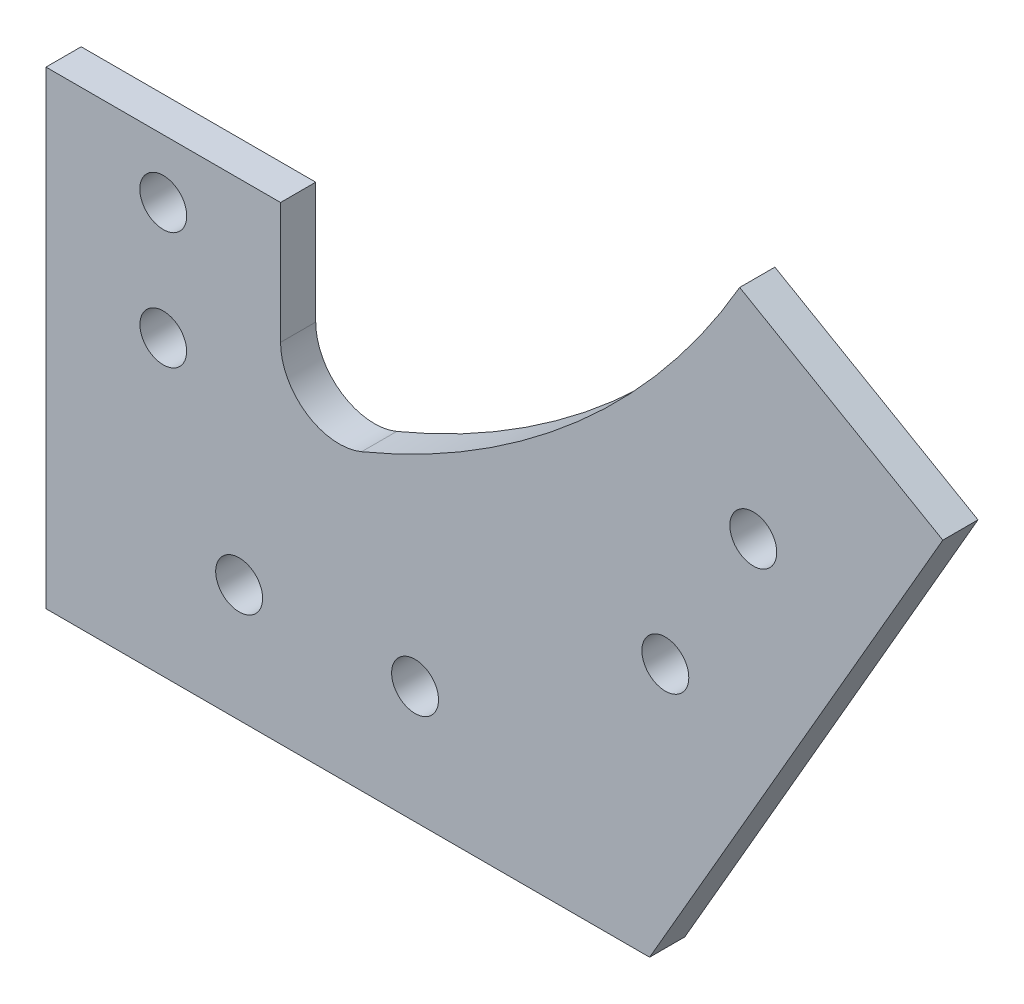
ISO-10303-21;
HEADER;
FILE_DESCRIPTION(('STEP AP214'),'2;1');
FILE_NAME('part.step','',(''),(''),'','','');
FILE_SCHEMA(('AUTOMOTIVE_DESIGN { 1 0 10303 214 1 1 1 1 }'));
ENDSEC;
DATA;
#1=APPLICATION_CONTEXT('core data for automotive mechanical design processes');
#2=APPLICATION_PROTOCOL_DEFINITION('international standard','automotive_design',2000,#1);
#3=PRODUCT_CONTEXT('',#1,'mechanical');
#4=PRODUCT('Part','Part','',(#3));
#5=PRODUCT_RELATED_PRODUCT_CATEGORY('part','',(#4));
#6=PRODUCT_DEFINITION_FORMATION('','',#4);
#7=PRODUCT_DEFINITION_CONTEXT('part definition',#1,'design');
#8=PRODUCT_DEFINITION('design','',#6,#7);
#9=PRODUCT_DEFINITION_SHAPE('','',#8);
#10=(LENGTH_UNIT() NAMED_UNIT(*) SI_UNIT(.MILLI.,.METRE.));
#11=(NAMED_UNIT(*) PLANE_ANGLE_UNIT() SI_UNIT($,.RADIAN.));
#12=(NAMED_UNIT(*) SI_UNIT($,.STERADIAN.) SOLID_ANGLE_UNIT());
#13=UNCERTAINTY_MEASURE_WITH_UNIT(LENGTH_MEASURE(1.E-05),#10,'distance_accuracy_value','');
#14=(GEOMETRIC_REPRESENTATION_CONTEXT(3) GLOBAL_UNCERTAINTY_ASSIGNED_CONTEXT((#13)) GLOBAL_UNIT_ASSIGNED_CONTEXT((#10,
#11,#12)) REPRESENTATION_CONTEXT('',''));
#15=CARTESIAN_POINT('',(0.,0.,0.));
#16=DIRECTION('',(0.,0.,1.));
#17=DIRECTION('',(1.,0.,0.));
#18=AXIS2_PLACEMENT_3D('',#15,#16,#17);
#19=CARTESIAN_POINT('',(-11.6514577470838,-45.9841600862571,3.));
#20=DIRECTION('',(0.,0.,1.));
#21=DIRECTION('',(1.,0.,0.));
#22=AXIS2_PLACEMENT_3D('',#19,#20,#21);
#23=PLANE('',#22);
#24=CARTESIAN_POINT('',(16.158288215072,-53.3345484545726,3.));
#25=DIRECTION('',(0.,0.,1.));
#26=DIRECTION('',(1.,0.,0.));
#27=AXIS2_PLACEMENT_3D('',#24,#25,#26);
#28=CIRCLE('',#27,2.);
#29=CARTESIAN_POINT('',(18.158288215072,-53.3345484545726,3.));
#30=VERTEX_POINT('',#29);
#31=EDGE_CURVE('E243',#30,#30,#28,.T.);
#32=ORIENTED_EDGE('',*,*,#31,.F.);
#33=EDGE_LOOP('',(#32));
#34=FACE_BOUND('',#33,.T.);
#35=CARTESIAN_POINT('',(-20.1814577470836,-65.6550565302616,3.));
#36=DIRECTION('',(0.,0.,1.));
#37=DIRECTION('',(1.,0.,0.));
#38=AXIS2_PLACEMENT_3D('',#35,#36,#37);
#39=CIRCLE('',#38,2.);
#40=CARTESIAN_POINT('',(-18.1814577470836,-65.6550565302616,3.));
#41=VERTEX_POINT('',#40);
#42=EDGE_CURVE('E227',#41,#41,#39,.T.);
#43=ORIENTED_EDGE('',*,*,#42,.F.);
#44=EDGE_LOOP('',(#43));
#45=FACE_BOUND('',#44,.T.);
#46=CARTESIAN_POINT('',(-26.6514577470838,-40.655056530261,3.));
#47=DIRECTION('',(0.,0.,1.));
#48=DIRECTION('',(1.,0.,0.));
#49=AXIS2_PLACEMENT_3D('',#46,#47,#48);
#50=CIRCLE('',#49,2.00000000000002);
#51=CARTESIAN_POINT('',(-24.6514577470838,-40.655056530261,3.));
#52=VERTEX_POINT('',#51);
#53=EDGE_CURVE('E152',#52,#52,#50,.T.);
#54=ORIENTED_EDGE('',*,*,#53,.F.);
#55=EDGE_LOOP('',(#54));
#56=FACE_BOUND('',#55,.T.);
#57=CARTESIAN_POINT('',(-11.6514577470838,-45.9841600862571,3.));
#58=DIRECTION('',(0.,0.,-1.));
#59=DIRECTION('',(1.,0.,0.));
#60=AXIS2_PLACEMENT_3D('',#57,#58,#59);
#61=CIRCLE('',#60,5.00000000000006);
#62=CARTESIAN_POINT('',(-9.74163391064401,-50.6050445160786,3.));
#63=VERTEX_POINT('',#62);
#64=CARTESIAN_POINT('',(-16.6514577470838,-45.9841600862571,3.));
#65=VERTEX_POINT('',#64);
#66=EDGE_CURVE('E170',#63,#65,#61,.T.);
#67=ORIENTED_EDGE('',*,*,#66,.T.);
#68=DIRECTION('',(0.,1.,0.));
#69=VECTOR('',#68,1.);
#70=CARTESIAN_POINT('',(-16.6514577470838,-45.9841600862571,3.));
#71=LINE('',#70,#69);
#72=CARTESIAN_POINT('',(-16.6514577470838,-35.6550565302611,3.));
#73=VERTEX_POINT('',#72);
#74=EDGE_CURVE('E106',#65,#73,#71,.T.);
#75=ORIENTED_EDGE('',*,*,#74,.T.);
#76=DIRECTION('',(-1.,0.,0.));
#77=VECTOR('',#76,1.);
#78=CARTESIAN_POINT('',(-16.6514577470838,-35.6550565302611,3.));
#79=LINE('',#78,#77);
#80=CARTESIAN_POINT('',(-36.6514577470841,-35.6550565302611,3.));
#81=VERTEX_POINT('',#80);
#82=EDGE_CURVE('E191',#73,#81,#79,.T.);
#83=ORIENTED_EDGE('',*,*,#82,.T.);
#84=DIRECTION('',(0.,-1.,0.));
#85=VECTOR('',#84,1.);
#86=CARTESIAN_POINT('',(-36.6514577470841,-35.6550565302611,3.));
#87=LINE('',#86,#85);
#88=CARTESIAN_POINT('',(-36.6514577470841,-75.6550565302616,3.));
#89=VERTEX_POINT('',#88);
#90=EDGE_CURVE('E205',#81,#89,#87,.T.);
#91=ORIENTED_EDGE('',*,*,#90,.T.);
#92=DIRECTION('',(1.,0.,0.));
#93=VECTOR('',#92,1.);
#94=CARTESIAN_POINT('',(-36.6514577470841,-75.6550565302616,3.));
#95=LINE('',#94,#93);
#96=CARTESIAN_POINT('',(14.8185422529163,-75.6550565302616,3.));
#97=VERTEX_POINT('',#96);
#98=EDGE_CURVE('E125',#89,#97,#95,.T.);
#99=ORIENTED_EDGE('',*,*,#98,.T.);
#100=DIRECTION('',(0.499999999999998,0.86602540378444,0.));
#101=VECTOR('',#100,1.);
#102=CARTESIAN_POINT('',(14.8185422529163,-75.6550565302616,3.));
#103=LINE('',#102,#101);
#104=CARTESIAN_POINT('',(39.8185422529163,-32.3537863410396,3.));
#105=VERTEX_POINT('',#104);
#106=EDGE_CURVE('E119',#97,#105,#103,.T.);
#107=ORIENTED_EDGE('',*,*,#106,.T.);
#108=DIRECTION('',(-0.866025403784437,0.500000000000002,0.));
#109=VECTOR('',#108,1.);
#110=CARTESIAN_POINT('',(39.8185422529163,-32.3537863410396,3.));
#111=LINE('',#110,#109);
#112=CARTESIAN_POINT('',(22.4980341772276,-22.3537863410396,3.));
#113=VERTEX_POINT('',#112);
#114=EDGE_CURVE('E123',#105,#113,#111,.T.);
#115=ORIENTED_EDGE('',*,*,#114,.T.);
#116=CARTESIAN_POINT('',(-35.1814577470836,10.9474838481824,3.));
#117=DIRECTION('',(0.,0.,-1.));
#118=DIRECTION('',(1.,0.,0.));
#119=AXIS2_PLACEMENT_3D('',#116,#117,#118);
#120=CIRCLE('',#119,66.6025403784439);
#121=EDGE_CURVE('E63',#113,#63,#120,.T.);
#122=ORIENTED_EDGE('',*,*,#121,.T.);
#123=EDGE_LOOP('',(#67,#75,#83,#91,#99,#107,#115,#122));
#124=FACE_BOUND('',#123,.T.);
#125=CARTESIAN_POINT('',(-26.6514577470838,-50.655056530261,3.));
#126=DIRECTION('',(0.,0.,1.));
#127=DIRECTION('',(1.,0.,0.));
#128=AXIS2_PLACEMENT_3D('',#125,#126,#127);
#129=CIRCLE('',#128,1.99000000000001);
#130=CARTESIAN_POINT('',(-24.6614577470838,-50.655056530261,3.));
#131=VERTEX_POINT('',#130);
#132=EDGE_CURVE('E219',#131,#131,#129,.T.);
#133=ORIENTED_EDGE('',*,*,#132,.F.);
#134=EDGE_LOOP('',(#133));
#135=FACE_BOUND('',#134,.T.);
#136=CARTESIAN_POINT('',(-5.18145774708362,-65.6550565302616,3.));
#137=DIRECTION('',(0.,0.,1.));
#138=DIRECTION('',(1.,0.,0.));
#139=AXIS2_PLACEMENT_3D('',#136,#137,#138);
#140=CIRCLE('',#139,1.99999999999997);
#141=CARTESIAN_POINT('',(-3.18145774708365,-65.6550565302616,3.));
#142=VERTEX_POINT('',#141);
#143=EDGE_CURVE('E235',#142,#142,#140,.T.);
#144=ORIENTED_EDGE('',*,*,#143,.F.);
#145=EDGE_LOOP('',(#144));
#146=FACE_BOUND('',#145,.T.);
#147=CARTESIAN_POINT('',(23.658288215072,-40.3441673978061,3.));
#148=DIRECTION('',(0.,0.,1.));
#149=DIRECTION('',(1.,0.,0.));
#150=AXIS2_PLACEMENT_3D('',#147,#148,#149);
#151=CIRCLE('',#150,1.99999999999994);
#152=CARTESIAN_POINT('',(25.6582882150719,-40.3441673978061,3.));
#153=VERTEX_POINT('',#152);
#154=EDGE_CURVE('E251',#153,#153,#151,.T.);
#155=ORIENTED_EDGE('',*,*,#154,.F.);
#156=EDGE_LOOP('',(#155));
#157=FACE_BOUND('',#156,.T.);
#158=ADVANCED_FACE('F45',(#34,#45,#56,#124,#135,#146,#157),#23,.T.);
#159=CARTESIAN_POINT('',(-11.6514577470838,-45.9841600862571,0.));
#160=DIRECTION('',(0.,0.,1.));
#161=DIRECTION('',(1.,0.,0.));
#162=AXIS2_PLACEMENT_3D('',#159,#160,#161);
#163=PLANE('',#162);
#164=CARTESIAN_POINT('',(-11.6514577470838,-45.9841600862571,0.));
#165=DIRECTION('',(0.,0.,-1.));
#166=DIRECTION('',(1.,0.,0.));
#167=AXIS2_PLACEMENT_3D('',#164,#165,#166);
#168=CIRCLE('',#167,5.00000000000006);
#169=CARTESIAN_POINT('',(-9.74163391064401,-50.6050445160786,0.));
#170=VERTEX_POINT('',#169);
#171=CARTESIAN_POINT('',(-16.6514577470838,-45.9841600862571,0.));
#172=VERTEX_POINT('',#171);
#173=EDGE_CURVE('E147',#170,#172,#168,.T.);
#174=ORIENTED_EDGE('',*,*,#173,.F.);
#175=CARTESIAN_POINT('',(-35.1814577470836,10.9474838481824,0.));
#176=DIRECTION('',(0.,0.,-1.));
#177=DIRECTION('',(1.,0.,0.));
#178=AXIS2_PLACEMENT_3D('',#175,#176,#177);
#179=CIRCLE('',#178,66.6025403784439);
#180=CARTESIAN_POINT('',(22.4980341772276,-22.3537863410396,0.));
#181=VERTEX_POINT('',#180);
#182=EDGE_CURVE('E98',#181,#170,#179,.T.);
#183=ORIENTED_EDGE('',*,*,#182,.F.);
#184=DIRECTION('',(-0.866025403784437,0.500000000000002,0.));
#185=VECTOR('',#184,1.);
#186=CARTESIAN_POINT('',(39.8185422529163,-32.3537863410396,0.));
#187=LINE('',#186,#185);
#188=CARTESIAN_POINT('',(39.8185422529163,-32.3537863410396,0.));
#189=VERTEX_POINT('',#188);
#190=EDGE_CURVE('E92',#189,#181,#187,.T.);
#191=ORIENTED_EDGE('',*,*,#190,.F.);
#192=DIRECTION('',(0.499999999999998,0.86602540378444,0.));
#193=VECTOR('',#192,1.);
#194=CARTESIAN_POINT('',(14.8185422529163,-75.6550565302616,0.));
#195=LINE('',#194,#193);
#196=CARTESIAN_POINT('',(14.8185422529163,-75.6550565302616,0.));
#197=VERTEX_POINT('',#196);
#198=EDGE_CURVE('E134',#197,#189,#195,.T.);
#199=ORIENTED_EDGE('',*,*,#198,.F.);
#200=DIRECTION('',(1.,0.,0.));
#201=VECTOR('',#200,1.);
#202=CARTESIAN_POINT('',(-36.6514577470841,-75.6550565302616,0.));
#203=LINE('',#202,#201);
#204=CARTESIAN_POINT('',(-36.6514577470841,-75.6550565302616,0.));
#205=VERTEX_POINT('',#204);
#206=EDGE_CURVE('E161',#205,#197,#203,.T.);
#207=ORIENTED_EDGE('',*,*,#206,.F.);
#208=DIRECTION('',(0.,-1.,0.));
#209=VECTOR('',#208,1.);
#210=CARTESIAN_POINT('',(-36.6514577470841,-35.6550565302611,0.));
#211=LINE('',#210,#209);
#212=CARTESIAN_POINT('',(-36.6514577470841,-35.6550565302611,0.));
#213=VERTEX_POINT('',#212);
#214=EDGE_CURVE('E158',#213,#205,#211,.T.);
#215=ORIENTED_EDGE('',*,*,#214,.F.);
#216=DIRECTION('',(-1.,0.,0.));
#217=VECTOR('',#216,1.);
#218=CARTESIAN_POINT('',(-16.6514577470838,-35.6550565302611,0.));
#219=LINE('',#218,#217);
#220=CARTESIAN_POINT('',(-16.6514577470838,-35.6550565302611,0.));
#221=VERTEX_POINT('',#220);
#222=EDGE_CURVE('E155',#221,#213,#219,.T.);
#223=ORIENTED_EDGE('',*,*,#222,.F.);
#224=DIRECTION('',(0.,1.,0.));
#225=VECTOR('',#224,1.);
#226=CARTESIAN_POINT('',(-16.6514577470838,-45.9841600862571,0.));
#227=LINE('',#226,#225);
#228=EDGE_CURVE('E151',#172,#221,#227,.T.);
#229=ORIENTED_EDGE('',*,*,#228,.F.);
#230=EDGE_LOOP('',(#174,#183,#191,#199,#207,#215,#223,#229));
#231=FACE_BOUND('',#230,.T.);
#232=CARTESIAN_POINT('',(-26.6514577470838,-40.655056530261,0.));
#233=DIRECTION('',(0.,0.,1.));
#234=DIRECTION('',(1.,0.,0.));
#235=AXIS2_PLACEMENT_3D('',#232,#233,#234);
#236=CIRCLE('',#235,2.00000000000002);
#237=CARTESIAN_POINT('',(-24.6514577470838,-40.655056530261,0.));
#238=VERTEX_POINT('',#237);
#239=EDGE_CURVE('E215',#238,#238,#236,.T.);
#240=ORIENTED_EDGE('',*,*,#239,.T.);
#241=EDGE_LOOP('',(#240));
#242=FACE_BOUND('',#241,.T.);
#243=CARTESIAN_POINT('',(-26.6514577470838,-50.655056530261,0.));
#244=DIRECTION('',(0.,0.,1.));
#245=DIRECTION('',(1.,0.,0.));
#246=AXIS2_PLACEMENT_3D('',#243,#244,#245);
#247=CIRCLE('',#246,1.99000000000001);
#248=CARTESIAN_POINT('',(-24.6614577470838,-50.655056530261,0.));
#249=VERTEX_POINT('',#248);
#250=EDGE_CURVE('E223',#249,#249,#247,.T.);
#251=ORIENTED_EDGE('',*,*,#250,.T.);
#252=EDGE_LOOP('',(#251));
#253=FACE_BOUND('',#252,.T.);
#254=CARTESIAN_POINT('',(-20.1814577470836,-65.6550565302616,0.));
#255=DIRECTION('',(0.,0.,1.));
#256=DIRECTION('',(1.,0.,0.));
#257=AXIS2_PLACEMENT_3D('',#254,#255,#256);
#258=CIRCLE('',#257,2.);
#259=CARTESIAN_POINT('',(-18.1814577470836,-65.6550565302616,0.));
#260=VERTEX_POINT('',#259);
#261=EDGE_CURVE('E231',#260,#260,#258,.T.);
#262=ORIENTED_EDGE('',*,*,#261,.T.);
#263=EDGE_LOOP('',(#262));
#264=FACE_BOUND('',#263,.T.);
#265=CARTESIAN_POINT('',(-5.18145774708362,-65.6550565302616,0.));
#266=DIRECTION('',(0.,0.,1.));
#267=DIRECTION('',(1.,0.,0.));
#268=AXIS2_PLACEMENT_3D('',#265,#266,#267);
#269=CIRCLE('',#268,1.99999999999997);
#270=CARTESIAN_POINT('',(-3.18145774708365,-65.6550565302616,0.));
#271=VERTEX_POINT('',#270);
#272=EDGE_CURVE('E239',#271,#271,#269,.T.);
#273=ORIENTED_EDGE('',*,*,#272,.T.);
#274=EDGE_LOOP('',(#273));
#275=FACE_BOUND('',#274,.T.);
#276=CARTESIAN_POINT('',(16.158288215072,-53.3345484545726,0.));
#277=DIRECTION('',(0.,0.,1.));
#278=DIRECTION('',(1.,0.,0.));
#279=AXIS2_PLACEMENT_3D('',#276,#277,#278);
#280=CIRCLE('',#279,2.);
#281=CARTESIAN_POINT('',(18.158288215072,-53.3345484545726,0.));
#282=VERTEX_POINT('',#281);
#283=EDGE_CURVE('E247',#282,#282,#280,.T.);
#284=ORIENTED_EDGE('',*,*,#283,.T.);
#285=EDGE_LOOP('',(#284));
#286=FACE_BOUND('',#285,.T.);
#287=CARTESIAN_POINT('',(23.658288215072,-40.3441673978061,0.));
#288=DIRECTION('',(0.,0.,1.));
#289=DIRECTION('',(1.,0.,0.));
#290=AXIS2_PLACEMENT_3D('',#287,#288,#289);
#291=CIRCLE('',#290,1.99999999999994);
#292=CARTESIAN_POINT('',(25.6582882150719,-40.3441673978061,0.));
#293=VERTEX_POINT('',#292);
#294=EDGE_CURVE('E255',#293,#293,#291,.T.);
#295=ORIENTED_EDGE('',*,*,#294,.T.);
#296=EDGE_LOOP('',(#295));
#297=FACE_BOUND('',#296,.T.);
#298=ADVANCED_FACE('F195',(#231,#242,#253,#264,#275,#286,#297),#163,.F.);
#299=CARTESIAN_POINT('',(-11.6514577470838,-45.9841600862571,3.));
#300=DIRECTION('',(0.,0.,-1.));
#301=DIRECTION('',(-1.,0.,0.));
#302=AXIS2_PLACEMENT_3D('',#299,#300,#301);
#303=CYLINDRICAL_SURFACE('',#302,5.00000000000006);
#304=ORIENTED_EDGE('',*,*,#173,.T.);
#305=DIRECTION('',(0.,0.,-1.));
#306=VECTOR('',#305,1.);
#307=CARTESIAN_POINT('',(-16.6514577470838,-45.9841600862571,3.));
#308=LINE('',#307,#306);
#309=EDGE_CURVE('E11',#65,#172,#308,.T.);
#310=ORIENTED_EDGE('',*,*,#309,.F.);
#311=ORIENTED_EDGE('',*,*,#66,.F.);
#312=DIRECTION('',(0.,0.,-1.));
#313=VECTOR('',#312,1.);
#314=CARTESIAN_POINT('',(-9.74163391064401,-50.6050445160786,3.));
#315=LINE('',#314,#313);
#316=EDGE_CURVE('E143',#63,#170,#315,.T.);
#317=ORIENTED_EDGE('',*,*,#316,.T.);
#318=EDGE_LOOP('',(#304,#310,#311,#317));
#319=FACE_BOUND('',#318,.T.);
#320=ADVANCED_FACE('F47',(#319),#303,.F.);
#321=CARTESIAN_POINT('',(-16.6514577470838,-45.9841600862571,3.));
#322=DIRECTION('',(-1.,0.,0.));
#323=DIRECTION('',(0.,0.,1.));
#324=AXIS2_PLACEMENT_3D('',#321,#322,#323);
#325=PLANE('',#324);
#326=ORIENTED_EDGE('',*,*,#228,.T.);
#327=DIRECTION('',(0.,0.,-1.));
#328=VECTOR('',#327,1.);
#329=CARTESIAN_POINT('',(-16.6514577470838,-35.6550565302611,3.));
#330=LINE('',#329,#328);
#331=EDGE_CURVE('E55',#73,#221,#330,.T.);
#332=ORIENTED_EDGE('',*,*,#331,.F.);
#333=ORIENTED_EDGE('',*,*,#74,.F.);
#334=ORIENTED_EDGE('',*,*,#309,.T.);
#335=EDGE_LOOP('',(#326,#332,#333,#334));
#336=FACE_BOUND('',#335,.T.);
#337=ADVANCED_FACE('F291',(#336),#325,.F.);
#338=CARTESIAN_POINT('',(-16.6514577470838,-35.6550565302611,3.));
#339=DIRECTION('',(0.,-1.,0.));
#340=DIRECTION('',(0.,0.,-1.));
#341=AXIS2_PLACEMENT_3D('',#338,#339,#340);
#342=PLANE('',#341);
#343=ORIENTED_EDGE('',*,*,#222,.T.);
#344=DIRECTION('',(0.,0.,-1.));
#345=VECTOR('',#344,1.);
#346=CARTESIAN_POINT('',(-36.6514577470841,-35.6550565302611,3.));
#347=LINE('',#346,#345);
#348=EDGE_CURVE('E181',#81,#213,#347,.T.);
#349=ORIENTED_EDGE('',*,*,#348,.F.);
#350=ORIENTED_EDGE('',*,*,#82,.F.);
#351=ORIENTED_EDGE('',*,*,#331,.T.);
#352=EDGE_LOOP('',(#343,#349,#350,#351));
#353=FACE_BOUND('',#352,.T.);
#354=ADVANCED_FACE('F189',(#353),#342,.F.);
#355=CARTESIAN_POINT('',(-36.6514577470841,-35.6550565302611,3.));
#356=DIRECTION('',(1.,0.,0.));
#357=DIRECTION('',(0.,0.,-1.));
#358=AXIS2_PLACEMENT_3D('',#355,#356,#357);
#359=PLANE('',#358);
#360=ORIENTED_EDGE('',*,*,#214,.T.);
#361=DIRECTION('',(0.,0.,-1.));
#362=VECTOR('',#361,1.);
#363=CARTESIAN_POINT('',(-36.6514577470841,-75.6550565302616,3.));
#364=LINE('',#363,#362);
#365=EDGE_CURVE('E177',#89,#205,#364,.T.);
#366=ORIENTED_EDGE('',*,*,#365,.F.);
#367=ORIENTED_EDGE('',*,*,#90,.F.);
#368=ORIENTED_EDGE('',*,*,#348,.T.);
#369=EDGE_LOOP('',(#360,#366,#367,#368));
#370=FACE_BOUND('',#369,.T.);
#371=ADVANCED_FACE('F200',(#370),#359,.F.);
#372=CARTESIAN_POINT('',(-36.6514577470841,-75.6550565302616,3.));
#373=DIRECTION('',(0.,1.,0.));
#374=DIRECTION('',(0.,0.,1.));
#375=AXIS2_PLACEMENT_3D('',#372,#373,#374);
#376=PLANE('',#375);
#377=ORIENTED_EDGE('',*,*,#206,.T.);
#378=DIRECTION('',(0.,0.,-1.));
#379=VECTOR('',#378,1.);
#380=CARTESIAN_POINT('',(14.8185422529163,-75.6550565302616,3.));
#381=LINE('',#380,#379);
#382=EDGE_CURVE('E136',#97,#197,#381,.T.);
#383=ORIENTED_EDGE('',*,*,#382,.F.);
#384=ORIENTED_EDGE('',*,*,#98,.F.);
#385=ORIENTED_EDGE('',*,*,#365,.T.);
#386=EDGE_LOOP('',(#377,#383,#384,#385));
#387=FACE_BOUND('',#386,.T.);
#388=ADVANCED_FACE('F203',(#387),#376,.F.);
#389=CARTESIAN_POINT('',(14.8185422529163,-75.6550565302616,3.));
#390=DIRECTION('',(-0.86602540378444,0.499999999999998,0.));
#391=DIRECTION('',(-0.499999999999998,-0.86602540378444,0.));
#392=AXIS2_PLACEMENT_3D('',#389,#390,#391);
#393=PLANE('',#392);
#394=ORIENTED_EDGE('',*,*,#198,.T.);
#395=DIRECTION('',(0.,0.,-1.));
#396=VECTOR('',#395,1.);
#397=CARTESIAN_POINT('',(39.8185422529163,-32.3537863410396,3.));
#398=LINE('',#397,#396);
#399=EDGE_CURVE('E131',#105,#189,#398,.T.);
#400=ORIENTED_EDGE('',*,*,#399,.F.);
#401=ORIENTED_EDGE('',*,*,#106,.F.);
#402=ORIENTED_EDGE('',*,*,#382,.T.);
#403=EDGE_LOOP('',(#394,#400,#401,#402));
#404=FACE_BOUND('',#403,.T.);
#405=ADVANCED_FACE('F132',(#404),#393,.F.);
#406=CARTESIAN_POINT('',(39.8185422529163,-32.3537863410396,3.));
#407=DIRECTION('',(-0.500000000000002,-0.866025403784437,0.));
#408=DIRECTION('',(0.866025403784437,-0.500000000000002,0.));
#409=AXIS2_PLACEMENT_3D('',#406,#407,#408);
#410=PLANE('',#409);
#411=ORIENTED_EDGE('',*,*,#190,.T.);
#412=DIRECTION('',(0.,0.,-1.));
#413=VECTOR('',#412,1.);
#414=CARTESIAN_POINT('',(22.4980341772276,-22.3537863410396,3.));
#415=LINE('',#414,#413);
#416=EDGE_CURVE('E137',#113,#181,#415,.T.);
#417=ORIENTED_EDGE('',*,*,#416,.F.);
#418=ORIENTED_EDGE('',*,*,#114,.F.);
#419=ORIENTED_EDGE('',*,*,#399,.T.);
#420=EDGE_LOOP('',(#411,#417,#418,#419));
#421=FACE_BOUND('',#420,.T.);
#422=ADVANCED_FACE('F139',(#421),#410,.F.);
#423=CARTESIAN_POINT('',(-35.1814577470836,10.9474838481824,3.));
#424=DIRECTION('',(0.,0.,-1.));
#425=DIRECTION('',(-1.,0.,0.));
#426=AXIS2_PLACEMENT_3D('',#423,#424,#425);
#427=CYLINDRICAL_SURFACE('',#426,66.6025403784439);
#428=ORIENTED_EDGE('',*,*,#182,.T.);
#429=ORIENTED_EDGE('',*,*,#316,.F.);
#430=ORIENTED_EDGE('',*,*,#121,.F.);
#431=ORIENTED_EDGE('',*,*,#416,.T.);
#432=EDGE_LOOP('',(#428,#429,#430,#431));
#433=FACE_BOUND('',#432,.T.);
#434=ADVANCED_FACE('F279',(#433),#427,.F.);
#435=CARTESIAN_POINT('',(-26.6514577470838,-40.655056530261,3.));
#436=DIRECTION('',(0.,0.,-1.));
#437=DIRECTION('',(-1.,0.,0.));
#438=AXIS2_PLACEMENT_3D('',#435,#436,#437);
#439=CYLINDRICAL_SURFACE('',#438,2.00000000000002);
#440=ORIENTED_EDGE('',*,*,#53,.T.);
#441=EDGE_LOOP('',(#440));
#442=FACE_BOUND('',#441,.T.);
#443=ORIENTED_EDGE('',*,*,#239,.F.);
#444=EDGE_LOOP('',(#443));
#445=FACE_BOUND('',#444,.T.);
#446=ADVANCED_FACE('F276',(#442,#445),#439,.F.);
#447=CARTESIAN_POINT('',(-26.6514577470838,-50.655056530261,3.));
#448=DIRECTION('',(0.,0.,-1.));
#449=DIRECTION('',(-1.,0.,0.));
#450=AXIS2_PLACEMENT_3D('',#447,#448,#449);
#451=CYLINDRICAL_SURFACE('',#450,1.99000000000001);
#452=ORIENTED_EDGE('',*,*,#132,.T.);
#453=EDGE_LOOP('',(#452));
#454=FACE_BOUND('',#453,.T.);
#455=ORIENTED_EDGE('',*,*,#250,.F.);
#456=EDGE_LOOP('',(#455));
#457=FACE_BOUND('',#456,.T.);
#458=ADVANCED_FACE('F354',(#454,#457),#451,.F.);
#459=CARTESIAN_POINT('',(-20.1814577470836,-65.6550565302616,3.));
#460=DIRECTION('',(0.,0.,-1.));
#461=DIRECTION('',(-1.,0.,0.));
#462=AXIS2_PLACEMENT_3D('',#459,#460,#461);
#463=CYLINDRICAL_SURFACE('',#462,2.);
#464=ORIENTED_EDGE('',*,*,#42,.T.);
#465=EDGE_LOOP('',(#464));
#466=FACE_BOUND('',#465,.T.);
#467=ORIENTED_EDGE('',*,*,#261,.F.);
#468=EDGE_LOOP('',(#467));
#469=FACE_BOUND('',#468,.T.);
#470=ADVANCED_FACE('F362',(#466,#469),#463,.F.);
#471=CARTESIAN_POINT('',(-5.18145774708362,-65.6550565302616,3.));
#472=DIRECTION('',(0.,0.,-1.));
#473=DIRECTION('',(-1.,0.,0.));
#474=AXIS2_PLACEMENT_3D('',#471,#472,#473);
#475=CYLINDRICAL_SURFACE('',#474,1.99999999999997);
#476=ORIENTED_EDGE('',*,*,#143,.T.);
#477=EDGE_LOOP('',(#476));
#478=FACE_BOUND('',#477,.T.);
#479=ORIENTED_EDGE('',*,*,#272,.F.);
#480=EDGE_LOOP('',(#479));
#481=FACE_BOUND('',#480,.T.);
#482=ADVANCED_FACE('F370',(#478,#481),#475,.F.);
#483=CARTESIAN_POINT('',(16.158288215072,-53.3345484545726,3.));
#484=DIRECTION('',(0.,0.,-1.));
#485=DIRECTION('',(-1.,0.,0.));
#486=AXIS2_PLACEMENT_3D('',#483,#484,#485);
#487=CYLINDRICAL_SURFACE('',#486,2.);
#488=ORIENTED_EDGE('',*,*,#31,.T.);
#489=EDGE_LOOP('',(#488));
#490=FACE_BOUND('',#489,.T.);
#491=ORIENTED_EDGE('',*,*,#283,.F.);
#492=EDGE_LOOP('',(#491));
#493=FACE_BOUND('',#492,.T.);
#494=ADVANCED_FACE('F379',(#490,#493),#487,.F.);
#495=CARTESIAN_POINT('',(23.658288215072,-40.3441673978061,3.));
#496=DIRECTION('',(0.,0.,-1.));
#497=DIRECTION('',(-1.,0.,0.));
#498=AXIS2_PLACEMENT_3D('',#495,#496,#497);
#499=CYLINDRICAL_SURFACE('',#498,1.99999999999994);
#500=ORIENTED_EDGE('',*,*,#154,.T.);
#501=EDGE_LOOP('',(#500));
#502=FACE_BOUND('',#501,.T.);
#503=ORIENTED_EDGE('',*,*,#294,.F.);
#504=EDGE_LOOP('',(#503));
#505=FACE_BOUND('',#504,.T.);
#506=ADVANCED_FACE('F263',(#502,#505),#499,.F.);
#507=CLOSED_SHELL('',(#158,#298,#320,#337,#354,#371,#388,#405,#422,#434,#446,#458,#470,#482,
#494,#506));
#508=MANIFOLD_SOLID_BREP('B2',#507);
#509=ADVANCED_BREP_SHAPE_REPRESENTATION('',(#18,#508),#14);
#510=SHAPE_DEFINITION_REPRESENTATION(#9,#509);
ENDSEC;
END-ISO-10303-21;
